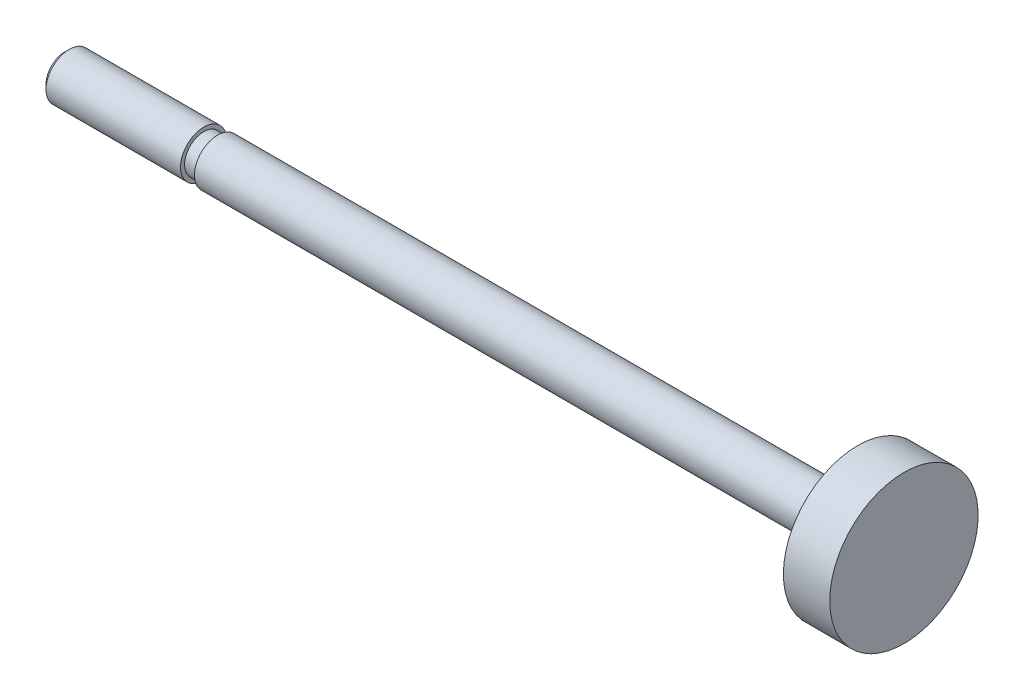
ISO-10303-21;
HEADER;
FILE_DESCRIPTION(('STEP AP214'),'2;1');
FILE_NAME('part.step','',(''),(''),'','','');
FILE_SCHEMA(('AUTOMOTIVE_DESIGN { 1 0 10303 214 1 1 1 1 }'));
ENDSEC;
DATA;
#1=APPLICATION_CONTEXT('core data for automotive mechanical design processes');
#2=APPLICATION_PROTOCOL_DEFINITION('international standard','automotive_design',2000,#1);
#3=PRODUCT_CONTEXT('',#1,'mechanical');
#4=PRODUCT('Part','Part','',(#3));
#5=PRODUCT_RELATED_PRODUCT_CATEGORY('part','',(#4));
#6=PRODUCT_DEFINITION_FORMATION('','',#4);
#7=PRODUCT_DEFINITION_CONTEXT('part definition',#1,'design');
#8=PRODUCT_DEFINITION('design','',#6,#7);
#9=PRODUCT_DEFINITION_SHAPE('','',#8);
#10=(LENGTH_UNIT() NAMED_UNIT(*) SI_UNIT(.MILLI.,.METRE.));
#11=(NAMED_UNIT(*) PLANE_ANGLE_UNIT() SI_UNIT($,.RADIAN.));
#12=(NAMED_UNIT(*) SI_UNIT($,.STERADIAN.) SOLID_ANGLE_UNIT());
#13=UNCERTAINTY_MEASURE_WITH_UNIT(LENGTH_MEASURE(1.E-05),#10,'distance_accuracy_value','');
#14=(GEOMETRIC_REPRESENTATION_CONTEXT(3) GLOBAL_UNCERTAINTY_ASSIGNED_CONTEXT((#13)) GLOBAL_UNIT_ASSIGNED_CONTEXT((#10,
#11,#12)) REPRESENTATION_CONTEXT('',''));
#15=CARTESIAN_POINT('',(0.,0.,0.));
#16=DIRECTION('',(0.,0.,1.));
#17=DIRECTION('',(1.,0.,0.));
#18=AXIS2_PLACEMENT_3D('',#15,#16,#17);
#19=CARTESIAN_POINT('',(0.,-2.0095,2.0095));
#20=DIRECTION('',(-1.,0.,0.));
#21=DIRECTION('',(0.,1.,0.));
#22=AXIS2_PLACEMENT_3D('',#19,#20,#21);
#23=PLANE('',#22);
#24=CARTESIAN_POINT('',(0.,0.,0.));
#25=DIRECTION('',(-1.,0.,0.));
#26=DIRECTION('',(0.,0.,-1.));
#27=AXIS2_PLACEMENT_3D('',#24,#25,#26);
#28=CIRCLE('',#27,2.0095);
#29=CARTESIAN_POINT('',(0.,0.,-2.0095));
#30=VERTEX_POINT('',#29);
#31=EDGE_CURVE('E47',#30,#30,#28,.F.);
#32=ORIENTED_EDGE('',*,*,#31,.F.);
#33=EDGE_LOOP('',(#32));
#34=FACE_BOUND('',#33,.T.);
#35=ADVANCED_FACE('F15',(#34),#23,.T.);
#36=CARTESIAN_POINT('',(15.,-2.49999987914998,-2.5));
#37=DIRECTION('',(1.,0.,0.));
#38=DIRECTION('',(0.,1.,0.));
#39=AXIS2_PLACEMENT_3D('',#36,#37,#38);
#40=PLANE('',#39);
#41=CARTESIAN_POINT('',(15.,0.,0.));
#42=DIRECTION('',(1.,0.,0.));
#43=DIRECTION('',(0.,-1.41721898572201E-07,0.99999999999999));
#44=AXIS2_PLACEMENT_3D('',#41,#42,#43);
#45=CIRCLE('',#44,2.5);
#46=CARTESIAN_POINT('',(15.,-3.54304746430502E-07,2.49999999999997));
#47=VERTEX_POINT('',#46);
#48=EDGE_CURVE('E44',#47,#47,#45,.T.);
#49=ORIENTED_EDGE('',*,*,#48,.T.);
#50=EDGE_LOOP('',(#49));
#51=FACE_BOUND('',#50,.T.);
#52=CARTESIAN_POINT('',(15.,0.,0.));
#53=DIRECTION('',(-1.,0.,0.));
#54=DIRECTION('',(0.,0.,-1.));
#55=AXIS2_PLACEMENT_3D('',#52,#53,#54);
#56=CIRCLE('',#55,2.067);
#57=CARTESIAN_POINT('',(15.,0.,-2.067));
#58=VERTEX_POINT('',#57);
#59=EDGE_CURVE('E41',#58,#58,#56,.F.);
#60=ORIENTED_EDGE('',*,*,#59,.F.);
#61=EDGE_LOOP('',(#60));
#62=FACE_BOUND('',#61,.T.);
#63=ADVANCED_FACE('F54',(#51,#62),#40,.T.);
#64=CARTESIAN_POINT('',(16.5,-2.5,2.5));
#65=DIRECTION('',(-1.,0.,0.));
#66=DIRECTION('',(0.,1.,0.));
#67=AXIS2_PLACEMENT_3D('',#64,#65,#66);
#68=PLANE('',#67);
#69=CARTESIAN_POINT('',(16.5,0.,0.));
#70=DIRECTION('',(-1.,0.,0.));
#71=DIRECTION('',(0.,0.,-1.));
#72=AXIS2_PLACEMENT_3D('',#69,#70,#71);
#73=CIRCLE('',#72,2.5);
#74=CARTESIAN_POINT('',(16.5,0.,-2.5));
#75=VERTEX_POINT('',#74);
#76=EDGE_CURVE('E38',#75,#75,#73,.F.);
#77=ORIENTED_EDGE('',*,*,#76,.F.);
#78=EDGE_LOOP('',(#77));
#79=FACE_BOUND('',#78,.T.);
#80=CARTESIAN_POINT('',(16.5,0.,0.));
#81=DIRECTION('',(1.,0.,0.));
#82=DIRECTION('',(0.,-1.42019591163286E-07,0.99999999999999));
#83=AXIS2_PLACEMENT_3D('',#80,#81,#82);
#84=CIRCLE('',#83,2.067);
#85=CARTESIAN_POINT('',(16.5,-2.93554494934513E-07,2.06699999999998));
#86=VERTEX_POINT('',#85);
#87=EDGE_CURVE('E35',#86,#86,#84,.T.);
#88=ORIENTED_EDGE('',*,*,#87,.T.);
#89=EDGE_LOOP('',(#88));
#90=FACE_BOUND('',#89,.T.);
#91=ADVANCED_FACE('F60',(#79,#90),#68,.T.);
#92=CARTESIAN_POINT('',(85.5,-8.21859166127047,8.));
#93=DIRECTION('',(-1.,0.,0.));
#94=DIRECTION('',(0.,1.,0.));
#95=AXIS2_PLACEMENT_3D('',#92,#93,#94);
#96=PLANE('',#95);
#97=CARTESIAN_POINT('',(85.5,0.,0.));
#98=DIRECTION('',(-1.,0.,0.));
#99=DIRECTION('',(0.,0.,-1.));
#100=AXIS2_PLACEMENT_3D('',#97,#98,#99);
#101=CIRCLE('',#100,8.);
#102=CARTESIAN_POINT('',(85.5,0.,-8.));
#103=VERTEX_POINT('',#102);
#104=EDGE_CURVE('E30',#103,#103,#101,.F.);
#105=ORIENTED_EDGE('',*,*,#104,.F.);
#106=EDGE_LOOP('',(#105));
#107=FACE_BOUND('',#106,.T.);
#108=CARTESIAN_POINT('',(85.5,0.,0.));
#109=DIRECTION('',(1.,0.,0.));
#110=DIRECTION('',(0.,-1.42053902152386E-07,0.99999999999999));
#111=AXIS2_PLACEMENT_3D('',#108,#109,#110);
#112=CIRCLE('',#111,2.5);
#113=CARTESIAN_POINT('',(85.5,-3.55134755380964E-07,2.49999999999997));
#114=VERTEX_POINT('',#113);
#115=EDGE_CURVE('E26',#114,#114,#112,.T.);
#116=ORIENTED_EDGE('',*,*,#115,.T.);
#117=EDGE_LOOP('',(#116));
#118=FACE_BOUND('',#117,.T.);
#119=ADVANCED_FACE('F66',(#107,#118),#96,.T.);
#120=CARTESIAN_POINT('',(90.5,-8.21859166127047,-8.));
#121=DIRECTION('',(1.,0.,0.));
#122=DIRECTION('',(0.,1.,0.));
#123=AXIS2_PLACEMENT_3D('',#120,#121,#122);
#124=PLANE('',#123);
#125=CARTESIAN_POINT('',(90.5,0.,0.));
#126=DIRECTION('',(1.,0.,0.));
#127=DIRECTION('',(0.,0.,1.));
#128=AXIS2_PLACEMENT_3D('',#125,#126,#127);
#129=CIRCLE('',#128,8.);
#130=CARTESIAN_POINT('',(90.5,0.,8.));
#131=VERTEX_POINT('',#130);
#132=EDGE_CURVE('E22',#131,#131,#129,.T.);
#133=ORIENTED_EDGE('',*,*,#132,.T.);
#134=EDGE_LOOP('',(#133));
#135=FACE_BOUND('',#134,.T.);
#136=ADVANCED_FACE('F70',(#135),#124,.T.);
#137=CARTESIAN_POINT('',(0.490500000000003,0.,0.));
#138=DIRECTION('',(1.,0.,0.));
#139=DIRECTION('',(0.,1.92326721555755E-10,1.));
#140=AXIS2_PLACEMENT_3D('',#137,#138,#139);
#141=CONICAL_SURFACE('',#140,2.5,0.785398163397443);
#142=CARTESIAN_POINT('',(0.490500000000003,0.,0.));
#143=DIRECTION('',(-1.,0.,0.));
#144=DIRECTION('',(0.,0.,-1.));
#145=AXIS2_PLACEMENT_3D('',#142,#143,#144);
#146=CIRCLE('',#145,2.5);
#147=CARTESIAN_POINT('',(0.490500000000003,0.,-2.5));
#148=VERTEX_POINT('',#147);
#149=EDGE_CURVE('E10',#148,#148,#146,.F.);
#150=ORIENTED_EDGE('',*,*,#149,.F.);
#151=EDGE_LOOP('',(#150));
#152=FACE_BOUND('',#151,.T.);
#153=ORIENTED_EDGE('',*,*,#31,.T.);
#154=EDGE_LOOP('',(#153));
#155=FACE_BOUND('',#154,.T.);
#156=ADVANCED_FACE('F51',(#152,#155),#141,.T.);
#157=CARTESIAN_POINT('',(90.5,0.,0.));
#158=DIRECTION('',(1.,0.,0.));
#159=DIRECTION('',(0.,7.6930696291819E-10,1.));
#160=AXIS2_PLACEMENT_3D('',#157,#158,#159);
#161=CYLINDRICAL_SURFACE('',#160,2.5);
#162=ORIENTED_EDGE('',*,*,#48,.F.);
#163=EDGE_LOOP('',(#162));
#164=FACE_BOUND('',#163,.T.);
#165=ORIENTED_EDGE('',*,*,#149,.T.);
#166=EDGE_LOOP('',(#165));
#167=FACE_BOUND('',#166,.T.);
#168=ADVANCED_FACE('F76',(#164,#167),#161,.T.);
#169=CARTESIAN_POINT('',(90.5,0.,0.));
#170=DIRECTION('',(1.,0.,0.));
#171=DIRECTION('',(0.,1.41620379990111E-07,0.99999999999999));
#172=AXIS2_PLACEMENT_3D('',#169,#170,#171);
#173=CYLINDRICAL_SURFACE('',#172,2.067);
#174=ORIENTED_EDGE('',*,*,#87,.F.);
#175=EDGE_LOOP('',(#174));
#176=FACE_BOUND('',#175,.T.);
#177=ORIENTED_EDGE('',*,*,#59,.T.);
#178=EDGE_LOOP('',(#177));
#179=FACE_BOUND('',#178,.T.);
#180=ADVANCED_FACE('F80',(#176,#179),#173,.T.);
#181=CARTESIAN_POINT('',(90.5,0.,0.));
#182=DIRECTION('',(1.,0.,0.));
#183=DIRECTION('',(0.,0.,1.));
#184=AXIS2_PLACEMENT_3D('',#181,#182,#183);
#185=CYLINDRICAL_SURFACE('',#184,2.5);
#186=ORIENTED_EDGE('',*,*,#115,.F.);
#187=EDGE_LOOP('',(#186));
#188=FACE_BOUND('',#187,.T.);
#189=ORIENTED_EDGE('',*,*,#76,.T.);
#190=EDGE_LOOP('',(#189));
#191=FACE_BOUND('',#190,.T.);
#192=ADVANCED_FACE('F83',(#188,#191),#185,.T.);
#193=CARTESIAN_POINT('',(90.5,0.,0.));
#194=DIRECTION('',(1.,0.,0.));
#195=DIRECTION('',(0.,0.,1.));
#196=AXIS2_PLACEMENT_3D('',#193,#194,#195);
#197=CYLINDRICAL_SURFACE('',#196,8.);
#198=ORIENTED_EDGE('',*,*,#132,.F.);
#199=EDGE_LOOP('',(#198));
#200=FACE_BOUND('',#199,.T.);
#201=ORIENTED_EDGE('',*,*,#104,.T.);
#202=EDGE_LOOP('',(#201));
#203=FACE_BOUND('',#202,.T.);
#204=ADVANCED_FACE('F17',(#200,#203),#197,.T.);
#205=CLOSED_SHELL('',(#35,#63,#91,#119,#136,#156,#168,#180,#192,#204));
#206=MANIFOLD_SOLID_BREP('B1',#205);
#207=ADVANCED_BREP_SHAPE_REPRESENTATION('',(#18,#206),#14);
#208=SHAPE_DEFINITION_REPRESENTATION(#9,#207);
ENDSEC;
END-ISO-10303-21;
